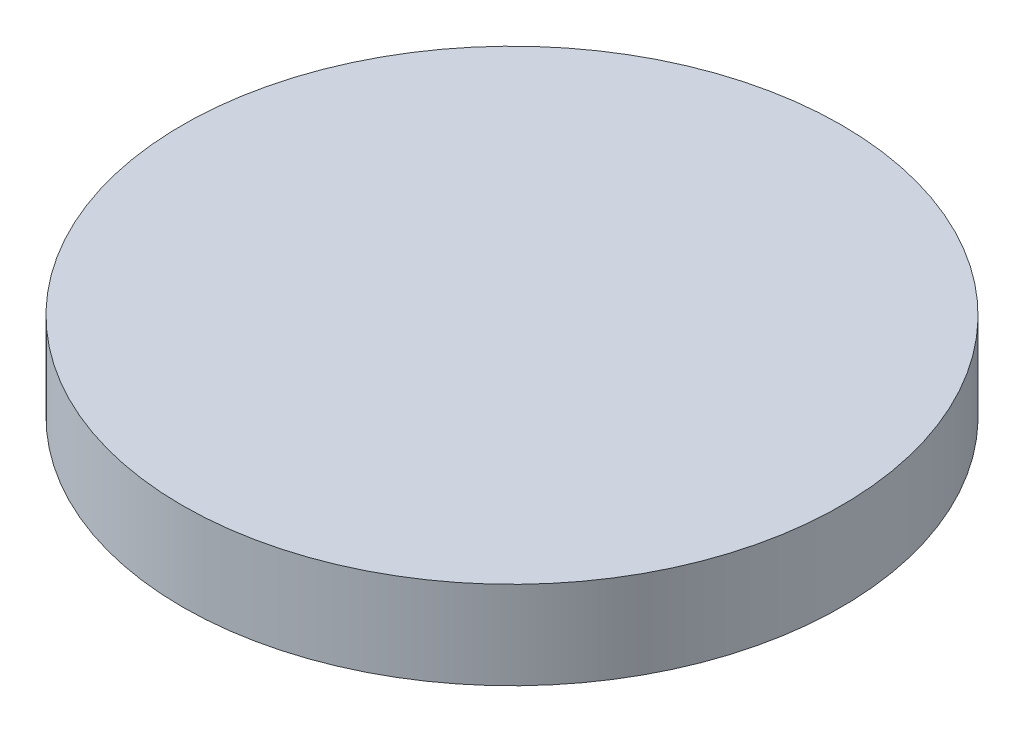
ISO-10303-21;
HEADER;
FILE_DESCRIPTION(('STEP AP214'),'2;1');
FILE_NAME('part.step','',(''),(''),'','','');
FILE_SCHEMA(('AUTOMOTIVE_DESIGN { 1 0 10303 214 1 1 1 1 }'));
ENDSEC;
DATA;
#1=APPLICATION_CONTEXT('core data for automotive mechanical design processes');
#2=APPLICATION_PROTOCOL_DEFINITION('international standard','automotive_design',2000,#1);
#3=PRODUCT_CONTEXT('',#1,'mechanical');
#4=PRODUCT('Part','Part','',(#3));
#5=PRODUCT_RELATED_PRODUCT_CATEGORY('part','',(#4));
#6=PRODUCT_DEFINITION_FORMATION('','',#4);
#7=PRODUCT_DEFINITION_CONTEXT('part definition',#1,'design');
#8=PRODUCT_DEFINITION('design','',#6,#7);
#9=PRODUCT_DEFINITION_SHAPE('','',#8);
#10=(LENGTH_UNIT() NAMED_UNIT(*) SI_UNIT(.MILLI.,.METRE.));
#11=(NAMED_UNIT(*) PLANE_ANGLE_UNIT() SI_UNIT($,.RADIAN.));
#12=(NAMED_UNIT(*) SI_UNIT($,.STERADIAN.) SOLID_ANGLE_UNIT());
#13=UNCERTAINTY_MEASURE_WITH_UNIT(LENGTH_MEASURE(1.E-05),#10,'distance_accuracy_value','');
#14=(GEOMETRIC_REPRESENTATION_CONTEXT(3) GLOBAL_UNCERTAINTY_ASSIGNED_CONTEXT((#13)) GLOBAL_UNIT_ASSIGNED_CONTEXT((#10,
#11,#12)) REPRESENTATION_CONTEXT('',''));
#15=CARTESIAN_POINT('',(0.,0.,0.));
#16=DIRECTION('',(0.,0.,1.));
#17=DIRECTION('',(1.,0.,0.));
#18=AXIS2_PLACEMENT_3D('',#15,#16,#17);
#19=CARTESIAN_POINT('',(-59.3033765648367,6.35,-6.57835468517228));
#20=DIRECTION('',(0.,-1.,0.));
#21=DIRECTION('',(0.,0.,-1.));
#22=AXIS2_PLACEMENT_3D('',#19,#20,#21);
#23=CYLINDRICAL_SURFACE('',#22,23.8125);
#24=CARTESIAN_POINT('',(-59.3033765648367,6.35,-6.57835468517228));
#25=DIRECTION('',(0.,1.,0.));
#26=DIRECTION('',(0.,0.,1.));
#27=AXIS2_PLACEMENT_3D('',#24,#25,#26);
#28=CIRCLE('',#27,23.8125);
#29=CARTESIAN_POINT('',(-59.3033765648367,6.35,17.2341453148277));
#30=VERTEX_POINT('',#29);
#31=EDGE_CURVE('E10',#30,#30,#28,.T.);
#32=ORIENTED_EDGE('',*,*,#31,.F.);
#33=EDGE_LOOP('',(#32));
#34=FACE_BOUND('',#33,.T.);
#35=CARTESIAN_POINT('',(-59.3033765648367,0.,-6.57835468517228));
#36=DIRECTION('',(0.,1.,0.));
#37=DIRECTION('',(0.,0.,1.));
#38=AXIS2_PLACEMENT_3D('',#35,#36,#37);
#39=CIRCLE('',#38,23.8125);
#40=CARTESIAN_POINT('',(-59.3033765648367,0.,17.2341453148277));
#41=VERTEX_POINT('',#40);
#42=EDGE_CURVE('E34',#41,#41,#39,.T.);
#43=ORIENTED_EDGE('',*,*,#42,.T.);
#44=EDGE_LOOP('',(#43));
#45=FACE_BOUND('',#44,.T.);
#46=ADVANCED_FACE('F31',(#34,#45),#23,.T.);
#47=CARTESIAN_POINT('',(-59.3033765648367,6.35,-6.57835468517228));
#48=DIRECTION('',(0.,1.,0.));
#49=DIRECTION('',(0.,0.,1.));
#50=AXIS2_PLACEMENT_3D('',#47,#48,#49);
#51=PLANE('',#50);
#52=ORIENTED_EDGE('',*,*,#31,.T.);
#53=EDGE_LOOP('',(#52));
#54=FACE_BOUND('',#53,.T.);
#55=ADVANCED_FACE('F46',(#54),#51,.T.);
#56=CARTESIAN_POINT('',(-59.3033765648367,0.,-6.57835468517228));
#57=DIRECTION('',(0.,1.,0.));
#58=DIRECTION('',(0.,0.,1.));
#59=AXIS2_PLACEMENT_3D('',#56,#57,#58);
#60=PLANE('',#59);
#61=ORIENTED_EDGE('',*,*,#42,.F.);
#62=EDGE_LOOP('',(#61));
#63=FACE_BOUND('',#62,.T.);
#64=ADVANCED_FACE('F44',(#63),#60,.F.);
#65=CLOSED_SHELL('',(#46,#55,#64));
#66=MANIFOLD_SOLID_BREP('B2',#65);
#67=ADVANCED_BREP_SHAPE_REPRESENTATION('',(#18,#66),#14);
#68=SHAPE_DEFINITION_REPRESENTATION(#9,#67);
ENDSEC;
END-ISO-10303-21;
